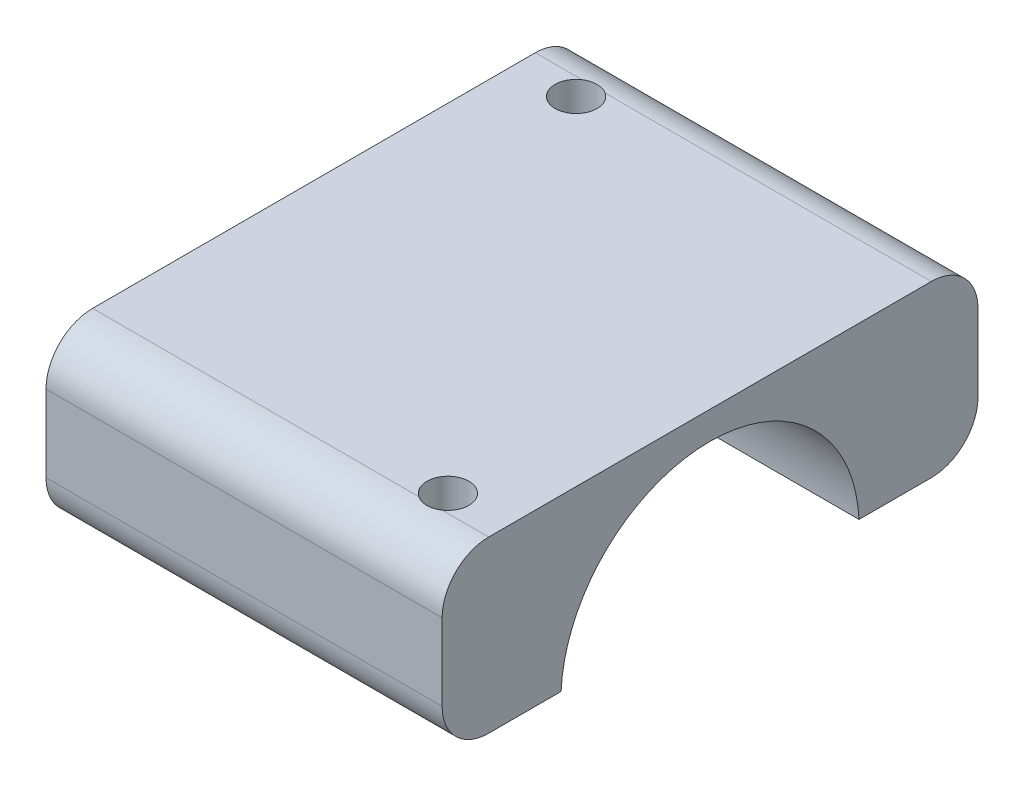
ISO-10303-21;
HEADER;
FILE_DESCRIPTION(('STEP AP214'),'2;1');
FILE_NAME('part.step','',(''),(''),'','','');
FILE_SCHEMA(('AUTOMOTIVE_DESIGN { 1 0 10303 214 1 1 1 1 }'));
ENDSEC;
DATA;
#1=APPLICATION_CONTEXT('core data for automotive mechanical design processes');
#2=APPLICATION_PROTOCOL_DEFINITION('international standard','automotive_design',2000,#1);
#3=PRODUCT_CONTEXT('',#1,'mechanical');
#4=PRODUCT('Part','Part','',(#3));
#5=PRODUCT_RELATED_PRODUCT_CATEGORY('part','',(#4));
#6=PRODUCT_DEFINITION_FORMATION('','',#4);
#7=PRODUCT_DEFINITION_CONTEXT('part definition',#1,'design');
#8=PRODUCT_DEFINITION('design','',#6,#7);
#9=PRODUCT_DEFINITION_SHAPE('','',#8);
#10=(LENGTH_UNIT() NAMED_UNIT(*) SI_UNIT(.MILLI.,.METRE.));
#11=(NAMED_UNIT(*) PLANE_ANGLE_UNIT() SI_UNIT($,.RADIAN.));
#12=(NAMED_UNIT(*) SI_UNIT($,.STERADIAN.) SOLID_ANGLE_UNIT());
#13=UNCERTAINTY_MEASURE_WITH_UNIT(LENGTH_MEASURE(1.E-05),#10,'distance_accuracy_value','');
#14=(GEOMETRIC_REPRESENTATION_CONTEXT(3) GLOBAL_UNCERTAINTY_ASSIGNED_CONTEXT((#13)) GLOBAL_UNIT_ASSIGNED_CONTEXT((#10,
#11,#12)) REPRESENTATION_CONTEXT('',''));
#15=CARTESIAN_POINT('',(0.,0.,0.));
#16=DIRECTION('',(0.,0.,1.));
#17=DIRECTION('',(1.,0.,0.));
#18=AXIS2_PLACEMENT_3D('',#15,#16,#17);
#19=CARTESIAN_POINT('',(17.,4.6,19.));
#20=DIRECTION('',(-1.,0.,0.));
#21=DIRECTION('',(0.,0.,1.));
#22=AXIS2_PLACEMENT_3D('',#19,#20,#21);
#23=CYLINDRICAL_SURFACE('',#22,4.);
#24=CARTESIAN_POINT('',(12.9949874371066,0.6,19.));
#25=CARTESIAN_POINT('',(12.9528080505859,0.600002290201008,19.0279782687762));
#26=CARTESIAN_POINT('',(12.9094699375662,0.600293109258532,19.054162436945));
#27=CARTESIAN_POINT('',(12.8207506643026,0.601246630542694,19.1027880961604));
#28=CARTESIAN_POINT('',(12.775369663094,0.601909303866988,19.1252298779078));
#29=CARTESIAN_POINT('',(12.6367080465194,0.60414515604213,19.1866521635867));
#30=CARTESIAN_POINT('',(12.5407755741953,0.605967454515857,19.2198177956695));
#31=CARTESIAN_POINT('',(12.3447108790185,0.609016111648687,19.2695824039112));
#32=CARTESIAN_POINT('',(12.2445771529861,0.610242254997947,19.2861753969049));
#33=CARTESIAN_POINT('',(12.0429252939834,0.611432977587128,19.3023260095373));
#34=CARTESIAN_POINT('',(11.9414072407699,0.611397629202322,19.3018846064864));
#35=CARTESIAN_POINT('',(11.7400149572337,0.6100843959537,19.2839916011113));
#36=CARTESIAN_POINT('',(11.6401391343925,0.608807797075412,19.266557603754));
#37=CARTESIAN_POINT('',(11.444762981889,0.605710678825216,19.2151942389305));
#38=CARTESIAN_POINT('',(11.3492591599958,0.603890602630139,19.181278297527));
#39=CARTESIAN_POINT('',(11.2134628948282,0.601745422922836,19.1197807652606));
#40=CARTESIAN_POINT('',(11.1703945654969,0.601136078493984,19.0981480345368));
#41=CARTESIAN_POINT('',(11.0862091669758,0.600264553601652,19.0515455180329));
#42=CARTESIAN_POINT('',(11.0450884560688,0.600001698383489,19.0265823227808));
#43=CARTESIAN_POINT('',(11.0050125628934,0.6,19.));
#44=B_SPLINE_CURVE_WITH_KNOTS('',3,(#24,#25,#26,#27,#28,#29,#30,#31,#32,#33,#34,#35,#36,#37,#38,
#39,#40,#41,#42,#43),.UNSPECIFIED.,.F.,.F.,(4,2,2,2,2,2,2,2,2,4),(0.,0.151748564164442,
0.30348533531734,0.606485618853393,0.90959525408197,1.21268749909945,1.51546606256915,
1.81799839737315,1.96246492195647,2.10664969408635),.UNSPECIFIED.);
#45=CARTESIAN_POINT('',(12.9949874371066,0.6,19.));
#46=VERTEX_POINT('',#45);
#47=CARTESIAN_POINT('',(11.0050125628934,0.6,19.));
#48=VERTEX_POINT('',#47);
#49=EDGE_CURVE('E136',#46,#48,#44,.T.);
#50=ORIENTED_EDGE('',*,*,#49,.F.);
#51=DIRECTION('',(-1.,0.,0.));
#52=VECTOR('',#51,1.);
#53=CARTESIAN_POINT('',(17.,0.6,19.));
#54=LINE('',#53,#52);
#55=CARTESIAN_POINT('',(17.,0.6,19.));
#56=VERTEX_POINT('',#55);
#57=EDGE_CURVE('E150',#56,#46,#54,.T.);
#58=ORIENTED_EDGE('',*,*,#57,.F.);
#59=CARTESIAN_POINT('',(17.,4.6,19.));
#60=DIRECTION('',(1.,0.,0.));
#61=DIRECTION('',(0.,0.,-1.));
#62=AXIS2_PLACEMENT_3D('',#59,#60,#61);
#63=CIRCLE('',#62,4.);
#64=CARTESIAN_POINT('',(17.,4.6,23.));
#65=VERTEX_POINT('',#64);
#66=EDGE_CURVE('E333',#65,#56,#63,.T.);
#67=ORIENTED_EDGE('',*,*,#66,.F.);
#68=DIRECTION('',(-1.,0.,0.));
#69=VECTOR('',#68,1.);
#70=CARTESIAN_POINT('',(17.,4.6,23.));
#71=LINE('',#70,#69);
#72=CARTESIAN_POINT('',(-17.,4.6,23.));
#73=VERTEX_POINT('',#72);
#74=EDGE_CURVE('E313',#65,#73,#71,.T.);
#75=ORIENTED_EDGE('',*,*,#74,.T.);
#76=CARTESIAN_POINT('',(-17.,4.6,19.));
#77=DIRECTION('',(1.,0.,0.));
#78=DIRECTION('',(0.,0.,-1.));
#79=AXIS2_PLACEMENT_3D('',#76,#77,#78);
#80=CIRCLE('',#79,4.);
#81=CARTESIAN_POINT('',(-17.,0.6,19.));
#82=VERTEX_POINT('',#81);
#83=EDGE_CURVE('E155',#73,#82,#80,.T.);
#84=ORIENTED_EDGE('',*,*,#83,.T.);
#85=EDGE_CURVE('E148',#48,#82,#54,.T.);
#86=ORIENTED_EDGE('',*,*,#85,.F.);
#87=EDGE_LOOP('',(#50,#58,#67,#75,#84,#86));
#88=FACE_BOUND('',#87,.T.);
#89=ADVANCED_FACE('F39',(#88),#23,.T.);
#90=CARTESIAN_POINT('',(17.,4.6,-19.));
#91=DIRECTION('',(-1.,0.,0.));
#92=DIRECTION('',(0.,0.,1.));
#93=AXIS2_PLACEMENT_3D('',#90,#91,#92);
#94=CYLINDRICAL_SURFACE('',#93,4.);
#95=CARTESIAN_POINT('',(-12.9949874371066,0.6,-19.));
#96=CARTESIAN_POINT('',(-12.9528080505859,0.600002290201007,-19.0279782687762));
#97=CARTESIAN_POINT('',(-12.9094699375662,0.600293109258532,-19.054162436945));
#98=CARTESIAN_POINT('',(-12.8207506643026,0.601246630542693,-19.1027880961604));
#99=CARTESIAN_POINT('',(-12.7753696630941,0.601909303866988,-19.1252298779078));
#100=CARTESIAN_POINT('',(-12.6367080465194,0.60414515604213,-19.1866521635867));
#101=CARTESIAN_POINT('',(-12.5407755741953,0.605967454515857,-19.2198177956695));
#102=CARTESIAN_POINT('',(-12.3447108790185,0.609016111648687,-19.2695824039112));
#103=CARTESIAN_POINT('',(-12.2445771529861,0.610242254997947,-19.2861753969049));
#104=CARTESIAN_POINT('',(-12.0429252939834,0.611432977587128,-19.3023260095373));
#105=CARTESIAN_POINT('',(-11.9414072407699,0.611397629202323,-19.3018846064864));
#106=CARTESIAN_POINT('',(-11.7400149572337,0.6100843959537,-19.2839916011113));
#107=CARTESIAN_POINT('',(-11.6401391343925,0.608807797075411,-19.266557603754));
#108=CARTESIAN_POINT('',(-11.444762981889,0.605710678825215,-19.2151942389305));
#109=CARTESIAN_POINT('',(-11.3492591599958,0.603890602630139,-19.181278297527));
#110=CARTESIAN_POINT('',(-11.2134628948282,0.601745422922837,-19.1197807652606));
#111=CARTESIAN_POINT('',(-11.1703945654969,0.601136078493984,-19.0981480345368));
#112=CARTESIAN_POINT('',(-11.0862091669758,0.600264553601652,-19.0515455180329));
#113=CARTESIAN_POINT('',(-11.0450884560688,0.600001698383489,-19.0265823227808));
#114=CARTESIAN_POINT('',(-11.0050125628934,0.6,-19.));
#115=B_SPLINE_CURVE_WITH_KNOTS('',3,(#95,#96,#97,#98,#99,#100,#101,#102,#103,#104,#105,#106,
#107,#108,#109,#110,#111,#112,#113,#114),.UNSPECIFIED.,.F.,.F.,(4,2,2,2,2,2,2,2,2,4),(0.,
0.15174856416444,0.303485335317343,0.606485618853397,0.909595254081976,1.21268749909945,
1.51546606256916,1.81799839737315,1.96246492195647,2.10664969408635),.UNSPECIFIED.);
#116=CARTESIAN_POINT('',(-12.9949874371066,0.6,-19.));
#117=VERTEX_POINT('',#116);
#118=CARTESIAN_POINT('',(-11.0050125628934,0.6,-19.));
#119=VERTEX_POINT('',#118);
#120=EDGE_CURVE('E194',#117,#119,#115,.T.);
#121=ORIENTED_EDGE('',*,*,#120,.F.);
#122=DIRECTION('',(-1.,0.,0.));
#123=VECTOR('',#122,1.);
#124=CARTESIAN_POINT('',(17.,0.6,-19.));
#125=LINE('',#124,#123);
#126=CARTESIAN_POINT('',(-17.,0.6,-19.));
#127=VERTEX_POINT('',#126);
#128=EDGE_CURVE('E159',#117,#127,#125,.T.);
#129=ORIENTED_EDGE('',*,*,#128,.T.);
#130=CARTESIAN_POINT('',(-17.,4.6,-19.));
#131=DIRECTION('',(1.,0.,0.));
#132=DIRECTION('',(0.,0.,-1.));
#133=AXIS2_PLACEMENT_3D('',#130,#131,#132);
#134=CIRCLE('',#133,4.);
#135=CARTESIAN_POINT('',(-17.,4.6,-23.));
#136=VERTEX_POINT('',#135);
#137=EDGE_CURVE('E319',#127,#136,#134,.T.);
#138=ORIENTED_EDGE('',*,*,#137,.T.);
#139=DIRECTION('',(-1.,0.,0.));
#140=VECTOR('',#139,1.);
#141=CARTESIAN_POINT('',(17.,4.6,-23.));
#142=LINE('',#141,#140);
#143=CARTESIAN_POINT('',(17.,4.6,-23.));
#144=VERTEX_POINT('',#143);
#145=EDGE_CURVE('E293',#144,#136,#142,.T.);
#146=ORIENTED_EDGE('',*,*,#145,.F.);
#147=CARTESIAN_POINT('',(17.,4.6,-19.));
#148=DIRECTION('',(1.,0.,0.));
#149=DIRECTION('',(0.,0.,-1.));
#150=AXIS2_PLACEMENT_3D('',#147,#148,#149);
#151=CIRCLE('',#150,4.);
#152=CARTESIAN_POINT('',(17.,0.6,-19.));
#153=VERTEX_POINT('',#152);
#154=EDGE_CURVE('E291',#153,#144,#151,.T.);
#155=ORIENTED_EDGE('',*,*,#154,.F.);
#156=EDGE_CURVE('E156',#153,#119,#125,.T.);
#157=ORIENTED_EDGE('',*,*,#156,.T.);
#158=EDGE_LOOP('',(#121,#129,#138,#146,#155,#157));
#159=FACE_BOUND('',#158,.T.);
#160=ADVANCED_FACE('F205',(#159),#94,.T.);
#161=CARTESIAN_POINT('',(17.,11.188,-19.));
#162=DIRECTION('',(-1.,0.,0.));
#163=DIRECTION('',(0.,0.,1.));
#164=AXIS2_PLACEMENT_3D('',#161,#162,#163);
#165=CYLINDRICAL_SURFACE('',#164,4.);
#166=CARTESIAN_POINT('',(-11.0050125628934,15.188,-19.));
#167=CARTESIAN_POINT('',(-11.0471919494141,15.187997709799,-19.0279782687762));
#168=CARTESIAN_POINT('',(-11.0905300624338,15.1877068907415,-19.054162436945));
#169=CARTESIAN_POINT('',(-11.1792493356974,15.1867533694573,-19.1027880961604));
#170=CARTESIAN_POINT('',(-11.224630336906,15.186090696133,-19.1252298779078));
#171=CARTESIAN_POINT('',(-11.3632919534806,15.1838548439579,-19.1866521635867));
#172=CARTESIAN_POINT('',(-11.4592244258047,15.1820325454841,-19.2198177956695));
#173=CARTESIAN_POINT('',(-11.6552891209815,15.1789838883513,-19.2695824039112));
#174=CARTESIAN_POINT('',(-11.7554228470139,15.1777577450021,-19.2861753969049));
#175=CARTESIAN_POINT('',(-11.9570747060166,15.1765670224129,-19.3023260095373));
#176=CARTESIAN_POINT('',(-12.0585927592301,15.1766023707977,-19.3018846064864));
#177=CARTESIAN_POINT('',(-12.2599850427663,15.1779156040463,-19.2839916011113));
#178=CARTESIAN_POINT('',(-12.3598608656075,15.1791922029246,-19.266557603754));
#179=CARTESIAN_POINT('',(-12.555237018111,15.1822893211748,-19.2151942389305));
#180=CARTESIAN_POINT('',(-12.6507408400042,15.1841093973699,-19.181278297527));
#181=CARTESIAN_POINT('',(-12.7865371051718,15.1862545770772,-19.1197807652606));
#182=CARTESIAN_POINT('',(-12.8296054345031,15.186863921506,-19.0981480345368));
#183=CARTESIAN_POINT('',(-12.9137908330242,15.1877354463983,-19.0515455180329));
#184=CARTESIAN_POINT('',(-12.9549115439312,15.1879983016165,-19.0265823227808));
#185=CARTESIAN_POINT('',(-12.9949874371066,15.188,-19.));
#186=B_SPLINE_CURVE_WITH_KNOTS('',3,(#166,#167,#168,#169,#170,#171,#172,#173,#174,#175,#176,
#177,#178,#179,#180,#181,#182,#183,#184,#185),.UNSPECIFIED.,.F.,.F.,(4,2,2,2,2,2,2,2,2,4),(0.,
0.15174856416444,0.303485335317342,0.60648561885339,0.909595254081968,1.21268749909944,
1.51546606256915,1.81799839737315,1.96246492195647,2.10664969408635),.UNSPECIFIED.);
#187=CARTESIAN_POINT('',(-11.0050125628934,15.188,-19.));
#188=VERTEX_POINT('',#187);
#189=CARTESIAN_POINT('',(-12.9949874371066,15.188,-19.));
#190=VERTEX_POINT('',#189);
#191=EDGE_CURVE('E142',#188,#190,#186,.T.);
#192=ORIENTED_EDGE('',*,*,#191,.F.);
#193=DIRECTION('',(-1.,0.,0.));
#194=VECTOR('',#193,1.);
#195=CARTESIAN_POINT('',(17.,15.188,-19.));
#196=LINE('',#195,#194);
#197=CARTESIAN_POINT('',(17.,15.188,-19.));
#198=VERTEX_POINT('',#197);
#199=EDGE_CURVE('E343',#198,#188,#196,.T.);
#200=ORIENTED_EDGE('',*,*,#199,.F.);
#201=CARTESIAN_POINT('',(17.,11.188,-19.));
#202=DIRECTION('',(1.,0.,0.));
#203=DIRECTION('',(0.,0.,-1.));
#204=AXIS2_PLACEMENT_3D('',#201,#202,#203);
#205=CIRCLE('',#204,4.);
#206=CARTESIAN_POINT('',(17.,11.188,-23.));
#207=VERTEX_POINT('',#206);
#208=EDGE_CURVE('E299',#207,#198,#205,.T.);
#209=ORIENTED_EDGE('',*,*,#208,.F.);
#210=DIRECTION('',(-1.,0.,0.));
#211=VECTOR('',#210,1.);
#212=CARTESIAN_POINT('',(17.,11.188,-23.));
#213=LINE('',#212,#211);
#214=CARTESIAN_POINT('',(-17.,11.188,-23.));
#215=VERTEX_POINT('',#214);
#216=EDGE_CURVE('E346',#207,#215,#213,.T.);
#217=ORIENTED_EDGE('',*,*,#216,.T.);
#218=CARTESIAN_POINT('',(-17.,11.188,-19.));
#219=DIRECTION('',(1.,0.,0.));
#220=DIRECTION('',(0.,0.,-1.));
#221=AXIS2_PLACEMENT_3D('',#218,#219,#220);
#222=CIRCLE('',#221,4.);
#223=CARTESIAN_POINT('',(-17.,15.188,-19.));
#224=VERTEX_POINT('',#223);
#225=EDGE_CURVE('E323',#215,#224,#222,.T.);
#226=ORIENTED_EDGE('',*,*,#225,.T.);
#227=EDGE_CURVE('E342',#190,#224,#196,.T.);
#228=ORIENTED_EDGE('',*,*,#227,.F.);
#229=EDGE_LOOP('',(#192,#200,#209,#217,#226,#228));
#230=FACE_BOUND('',#229,.T.);
#231=ADVANCED_FACE('F201',(#230),#165,.T.);
#232=CARTESIAN_POINT('',(17.,11.188,19.));
#233=DIRECTION('',(-1.,0.,0.));
#234=DIRECTION('',(0.,0.,1.));
#235=AXIS2_PLACEMENT_3D('',#232,#233,#234);
#236=CYLINDRICAL_SURFACE('',#235,4.);
#237=CARTESIAN_POINT('',(11.0050125628934,15.188,19.));
#238=CARTESIAN_POINT('',(11.0471919494141,15.187997709799,19.0279782687762));
#239=CARTESIAN_POINT('',(11.0905300624338,15.1877068907415,19.054162436945));
#240=CARTESIAN_POINT('',(11.1792493356974,15.1867533694573,19.1027880961604));
#241=CARTESIAN_POINT('',(11.224630336906,15.186090696133,19.1252298779078));
#242=CARTESIAN_POINT('',(11.3632919534806,15.1838548439579,19.1866521635867));
#243=CARTESIAN_POINT('',(11.4592244258047,15.1820325454841,19.2198177956695));
#244=CARTESIAN_POINT('',(11.6552891209815,15.1789838883513,19.2695824039112));
#245=CARTESIAN_POINT('',(11.7554228470139,15.1777577450021,19.2861753969049));
#246=CARTESIAN_POINT('',(11.9570747060166,15.1765670224129,19.3023260095373));
#247=CARTESIAN_POINT('',(12.0585927592301,15.1766023707977,19.3018846064864));
#248=CARTESIAN_POINT('',(12.2599850427663,15.1779156040463,19.2839916011113));
#249=CARTESIAN_POINT('',(12.3598608656075,15.1791922029246,19.266557603754));
#250=CARTESIAN_POINT('',(12.555237018111,15.1822893211748,19.2151942389305));
#251=CARTESIAN_POINT('',(12.6507408400042,15.1841093973699,19.181278297527));
#252=CARTESIAN_POINT('',(12.7865371051718,15.1862545770772,19.1197807652606));
#253=CARTESIAN_POINT('',(12.8296054345031,15.186863921506,19.0981480345368));
#254=CARTESIAN_POINT('',(12.9137908330242,15.1877354463983,19.0515455180329));
#255=CARTESIAN_POINT('',(12.9549115439312,15.1879983016165,19.0265823227808));
#256=CARTESIAN_POINT('',(12.9949874371066,15.188,19.));
#257=B_SPLINE_CURVE_WITH_KNOTS('',3,(#237,#238,#239,#240,#241,#242,#243,#244,#245,#246,#247,
#248,#249,#250,#251,#252,#253,#254,#255,#256),.UNSPECIFIED.,.F.,.F.,(4,2,2,2,2,2,2,2,2,4),(0.,
0.151748564164442,0.30348533531734,0.606485618853393,0.909595254081972,1.21268749909945,
1.51546606256915,1.81799839737315,1.96246492195647,2.10664969408635),.UNSPECIFIED.);
#258=CARTESIAN_POINT('',(11.0050125628934,15.188,19.));
#259=VERTEX_POINT('',#258);
#260=CARTESIAN_POINT('',(12.9949874371066,15.188,19.));
#261=VERTEX_POINT('',#260);
#262=EDGE_CURVE('E47',#259,#261,#257,.T.);
#263=ORIENTED_EDGE('',*,*,#262,.F.);
#264=DIRECTION('',(-1.,0.,0.));
#265=VECTOR('',#264,1.);
#266=CARTESIAN_POINT('',(17.,15.188,19.));
#267=LINE('',#266,#265);
#268=CARTESIAN_POINT('',(-17.,15.188,19.));
#269=VERTEX_POINT('',#268);
#270=EDGE_CURVE('E338',#259,#269,#267,.T.);
#271=ORIENTED_EDGE('',*,*,#270,.T.);
#272=CARTESIAN_POINT('',(-17.,11.188,19.));
#273=DIRECTION('',(1.,0.,0.));
#274=DIRECTION('',(0.,0.,-1.));
#275=AXIS2_PLACEMENT_3D('',#272,#273,#274);
#276=CIRCLE('',#275,4.);
#277=CARTESIAN_POINT('',(-17.,11.188,23.));
#278=VERTEX_POINT('',#277);
#279=EDGE_CURVE('E329',#269,#278,#276,.T.);
#280=ORIENTED_EDGE('',*,*,#279,.T.);
#281=DIRECTION('',(-1.,0.,0.));
#282=VECTOR('',#281,1.);
#283=CARTESIAN_POINT('',(17.,11.188,23.));
#284=LINE('',#283,#282);
#285=CARTESIAN_POINT('',(17.,11.188,23.));
#286=VERTEX_POINT('',#285);
#287=EDGE_CURVE('E335',#286,#278,#284,.T.);
#288=ORIENTED_EDGE('',*,*,#287,.F.);
#289=CARTESIAN_POINT('',(17.,11.188,19.));
#290=DIRECTION('',(1.,0.,0.));
#291=DIRECTION('',(0.,0.,-1.));
#292=AXIS2_PLACEMENT_3D('',#289,#290,#291);
#293=CIRCLE('',#292,4.);
#294=CARTESIAN_POINT('',(17.,15.188,19.));
#295=VERTEX_POINT('',#294);
#296=EDGE_CURVE('E309',#295,#286,#293,.T.);
#297=ORIENTED_EDGE('',*,*,#296,.F.);
#298=EDGE_CURVE('E339',#295,#261,#267,.T.);
#299=ORIENTED_EDGE('',*,*,#298,.T.);
#300=EDGE_LOOP('',(#263,#271,#280,#288,#297,#299));
#301=FACE_BOUND('',#300,.T.);
#302=ADVANCED_FACE('F168',(#301),#236,.T.);
#303=CARTESIAN_POINT('',(17.,0.6,19.));
#304=DIRECTION('',(0.,1.,0.));
#305=DIRECTION('',(0.,0.,1.));
#306=AXIS2_PLACEMENT_3D('',#303,#304,#305);
#307=PLANE('',#306);
#308=CARTESIAN_POINT('',(12.,0.6,17.5));
#309=DIRECTION('',(0.,1.,0.));
#310=DIRECTION('',(0.,0.,1.));
#311=AXIS2_PLACEMENT_3D('',#308,#309,#310);
#312=CIRCLE('',#311,1.8);
#313=EDGE_CURVE('E53',#46,#48,#312,.T.);
#314=ORIENTED_EDGE('',*,*,#313,.T.);
#315=ORIENTED_EDGE('',*,*,#85,.T.);
#316=DIRECTION('',(0.,0.,-1.));
#317=VECTOR('',#316,1.);
#318=CARTESIAN_POINT('',(-17.,0.6,19.));
#319=LINE('',#318,#317);
#320=CARTESIAN_POINT('',(-17.,0.6,12.7859297667397));
#321=VERTEX_POINT('',#320);
#322=EDGE_CURVE('E317',#82,#321,#319,.T.);
#323=ORIENTED_EDGE('',*,*,#322,.T.);
#324=DIRECTION('',(1.,0.,0.));
#325=VECTOR('',#324,1.);
#326=CARTESIAN_POINT('',(-17.,0.6,12.7859297667397));
#327=LINE('',#326,#325);
#328=CARTESIAN_POINT('',(17.,0.6,12.7859297667397));
#329=VERTEX_POINT('',#328);
#330=EDGE_CURVE('E316',#321,#329,#327,.T.);
#331=ORIENTED_EDGE('',*,*,#330,.T.);
#332=DIRECTION('',(0.,0.,-1.));
#333=VECTOR('',#332,1.);
#334=CARTESIAN_POINT('',(17.,0.6,19.));
#335=LINE('',#334,#333);
#336=EDGE_CURVE('E297',#56,#329,#335,.T.);
#337=ORIENTED_EDGE('',*,*,#336,.F.);
#338=ORIENTED_EDGE('',*,*,#57,.T.);
#339=EDGE_LOOP('',(#314,#315,#323,#331,#337,#338));
#340=FACE_BOUND('',#339,.T.);
#341=ADVANCED_FACE('F146',(#340),#307,.F.);
#342=CARTESIAN_POINT('',(-12.,0.6,-17.5));
#343=DIRECTION('',(0.,1.,0.));
#344=DIRECTION('',(0.,0.,1.));
#345=AXIS2_PLACEMENT_3D('',#342,#343,#344);
#346=CIRCLE('',#345,1.8);
#347=EDGE_CURVE('E60',#117,#119,#346,.T.);
#348=ORIENTED_EDGE('',*,*,#347,.T.);
#349=ORIENTED_EDGE('',*,*,#156,.F.);
#350=CARTESIAN_POINT('',(17.,0.6,-12.7859297667397));
#351=VERTEX_POINT('',#350);
#352=EDGE_CURVE('E302',#351,#153,#335,.T.);
#353=ORIENTED_EDGE('',*,*,#352,.F.);
#354=DIRECTION('',(1.,0.,0.));
#355=VECTOR('',#354,1.);
#356=CARTESIAN_POINT('',(-17.,0.6,-12.7859297667397));
#357=LINE('',#356,#355);
#358=CARTESIAN_POINT('',(-17.,0.6,-12.7859297667397));
#359=VERTEX_POINT('',#358);
#360=EDGE_CURVE('E352',#351,#359,#357,.F.);
#361=ORIENTED_EDGE('',*,*,#360,.T.);
#362=EDGE_CURVE('E315',#359,#127,#319,.T.);
#363=ORIENTED_EDGE('',*,*,#362,.T.);
#364=ORIENTED_EDGE('',*,*,#128,.F.);
#365=EDGE_LOOP('',(#348,#349,#353,#361,#363,#364));
#366=FACE_BOUND('',#365,.T.);
#367=ADVANCED_FACE('F210',(#366),#307,.F.);
#368=CARTESIAN_POINT('',(17.,4.6,-23.));
#369=DIRECTION('',(0.,0.,1.));
#370=DIRECTION('',(1.,0.,0.));
#371=AXIS2_PLACEMENT_3D('',#368,#369,#370);
#372=PLANE('',#371);
#373=DIRECTION('',(0.,1.,0.));
#374=VECTOR('',#373,1.);
#375=CARTESIAN_POINT('',(-17.,4.6,-23.));
#376=LINE('',#375,#374);
#377=EDGE_CURVE('E321',#136,#215,#376,.T.);
#378=ORIENTED_EDGE('',*,*,#377,.T.);
#379=ORIENTED_EDGE('',*,*,#216,.F.);
#380=DIRECTION('',(0.,1.,0.));
#381=VECTOR('',#380,1.);
#382=CARTESIAN_POINT('',(17.,4.6,-23.));
#383=LINE('',#382,#381);
#384=EDGE_CURVE('E296',#144,#207,#383,.T.);
#385=ORIENTED_EDGE('',*,*,#384,.F.);
#386=ORIENTED_EDGE('',*,*,#145,.T.);
#387=EDGE_LOOP('',(#378,#379,#385,#386));
#388=FACE_BOUND('',#387,.T.);
#389=ADVANCED_FACE('F208',(#388),#372,.F.);
#390=CARTESIAN_POINT('',(17.,15.188,-19.));
#391=DIRECTION('',(0.,-1.,0.));
#392=DIRECTION('',(0.,0.,-1.));
#393=AXIS2_PLACEMENT_3D('',#390,#391,#392);
#394=PLANE('',#393);
#395=CARTESIAN_POINT('',(12.,15.188,17.5));
#396=DIRECTION('',(0.,-1.,0.));
#397=DIRECTION('',(0.,0.,-1.));
#398=AXIS2_PLACEMENT_3D('',#395,#396,#397);
#399=CIRCLE('',#398,1.8);
#400=EDGE_CURVE('E143',#261,#259,#399,.F.);
#401=ORIENTED_EDGE('',*,*,#400,.F.);
#402=ORIENTED_EDGE('',*,*,#298,.F.);
#403=DIRECTION('',(0.,0.,1.));
#404=VECTOR('',#403,1.);
#405=CARTESIAN_POINT('',(17.,15.188,-19.));
#406=LINE('',#405,#404);
#407=EDGE_CURVE('E307',#198,#295,#406,.T.);
#408=ORIENTED_EDGE('',*,*,#407,.F.);
#409=ORIENTED_EDGE('',*,*,#199,.T.);
#410=CARTESIAN_POINT('',(-12.,15.188,-17.5));
#411=DIRECTION('',(0.,-1.,0.));
#412=DIRECTION('',(0.,0.,-1.));
#413=AXIS2_PLACEMENT_3D('',#410,#411,#412);
#414=CIRCLE('',#413,1.8);
#415=EDGE_CURVE('E11',#190,#188,#414,.F.);
#416=ORIENTED_EDGE('',*,*,#415,.F.);
#417=ORIENTED_EDGE('',*,*,#227,.T.);
#418=DIRECTION('',(0.,0.,1.));
#419=VECTOR('',#418,1.);
#420=CARTESIAN_POINT('',(-17.,15.188,-19.));
#421=LINE('',#420,#419);
#422=EDGE_CURVE('E326',#224,#269,#421,.T.);
#423=ORIENTED_EDGE('',*,*,#422,.T.);
#424=ORIENTED_EDGE('',*,*,#270,.F.);
#425=EDGE_LOOP('',(#401,#402,#408,#409,#416,#417,#423,#424));
#426=FACE_BOUND('',#425,.T.);
#427=ADVANCED_FACE('F207',(#426),#394,.F.);
#428=CARTESIAN_POINT('',(17.,11.188,23.));
#429=DIRECTION('',(0.,0.,-1.));
#430=DIRECTION('',(-1.,0.,0.));
#431=AXIS2_PLACEMENT_3D('',#428,#429,#430);
#432=PLANE('',#431);
#433=DIRECTION('',(0.,-1.,0.));
#434=VECTOR('',#433,1.);
#435=CARTESIAN_POINT('',(-17.,11.188,23.));
#436=LINE('',#435,#434);
#437=EDGE_CURVE('E331',#278,#73,#436,.T.);
#438=ORIENTED_EDGE('',*,*,#437,.T.);
#439=ORIENTED_EDGE('',*,*,#74,.F.);
#440=DIRECTION('',(0.,-1.,0.));
#441=VECTOR('',#440,1.);
#442=CARTESIAN_POINT('',(17.,11.188,23.));
#443=LINE('',#442,#441);
#444=EDGE_CURVE('E311',#286,#65,#443,.T.);
#445=ORIENTED_EDGE('',*,*,#444,.F.);
#446=ORIENTED_EDGE('',*,*,#287,.T.);
#447=EDGE_LOOP('',(#438,#439,#445,#446));
#448=FACE_BOUND('',#447,.T.);
#449=ADVANCED_FACE('F376',(#448),#432,.F.);
#450=CARTESIAN_POINT('',(17.,4.6,19.));
#451=DIRECTION('',(1.,0.,0.));
#452=DIRECTION('',(0.,0.,-1.));
#453=AXIS2_PLACEMENT_3D('',#450,#451,#452);
#454=PLANE('',#453);
#455=CARTESIAN_POINT('',(17.,0.,0.));
#456=DIRECTION('',(1.,0.,0.));
#457=DIRECTION('',(0.,0.,-1.));
#458=AXIS2_PLACEMENT_3D('',#455,#456,#457);
#459=CIRCLE('',#458,12.8);
#460=EDGE_CURVE('E285',#351,#329,#459,.T.);
#461=ORIENTED_EDGE('',*,*,#460,.F.);
#462=ORIENTED_EDGE('',*,*,#352,.T.);
#463=ORIENTED_EDGE('',*,*,#154,.T.);
#464=ORIENTED_EDGE('',*,*,#384,.T.);
#465=ORIENTED_EDGE('',*,*,#208,.T.);
#466=ORIENTED_EDGE('',*,*,#407,.T.);
#467=ORIENTED_EDGE('',*,*,#296,.T.);
#468=ORIENTED_EDGE('',*,*,#444,.T.);
#469=ORIENTED_EDGE('',*,*,#66,.T.);
#470=ORIENTED_EDGE('',*,*,#336,.T.);
#471=EDGE_LOOP('',(#461,#462,#463,#464,#465,#466,#467,#468,#469,#470));
#472=FACE_BOUND('',#471,.T.);
#473=ADVANCED_FACE('F363',(#472),#454,.T.);
#474=CARTESIAN_POINT('',(-17.,4.6,19.));
#475=DIRECTION('',(1.,0.,0.));
#476=DIRECTION('',(0.,0.,-1.));
#477=AXIS2_PLACEMENT_3D('',#474,#475,#476);
#478=PLANE('',#477);
#479=ORIENTED_EDGE('',*,*,#362,.F.);
#480=CARTESIAN_POINT('',(-17.,0.,0.));
#481=DIRECTION('',(1.,0.,0.));
#482=DIRECTION('',(0.,0.,-1.));
#483=AXIS2_PLACEMENT_3D('',#480,#481,#482);
#484=CIRCLE('',#483,12.8);
#485=EDGE_CURVE('E383',#359,#321,#484,.T.);
#486=ORIENTED_EDGE('',*,*,#485,.T.);
#487=ORIENTED_EDGE('',*,*,#322,.F.);
#488=ORIENTED_EDGE('',*,*,#83,.F.);
#489=ORIENTED_EDGE('',*,*,#437,.F.);
#490=ORIENTED_EDGE('',*,*,#279,.F.);
#491=ORIENTED_EDGE('',*,*,#422,.F.);
#492=ORIENTED_EDGE('',*,*,#225,.F.);
#493=ORIENTED_EDGE('',*,*,#377,.F.);
#494=ORIENTED_EDGE('',*,*,#137,.F.);
#495=EDGE_LOOP('',(#479,#486,#487,#488,#489,#490,#491,#492,#493,#494));
#496=FACE_BOUND('',#495,.T.);
#497=ADVANCED_FACE('F254',(#496),#478,.F.);
#498=CARTESIAN_POINT('',(-17.,0.,0.));
#499=DIRECTION('',(1.,0.,0.));
#500=DIRECTION('',(0.,0.,-1.));
#501=AXIS2_PLACEMENT_3D('',#498,#499,#500);
#502=CYLINDRICAL_SURFACE('',#501,12.8);
#503=ORIENTED_EDGE('',*,*,#485,.F.);
#504=ORIENTED_EDGE('',*,*,#360,.F.);
#505=ORIENTED_EDGE('',*,*,#460,.T.);
#506=ORIENTED_EDGE('',*,*,#330,.F.);
#507=EDGE_LOOP('',(#503,#504,#505,#506));
#508=FACE_BOUND('',#507,.T.);
#509=ADVANCED_FACE('F176',(#508),#502,.F.);
#510=CARTESIAN_POINT('',(12.,15.788,17.5));
#511=DIRECTION('',(0.,-1.,0.));
#512=DIRECTION('',(0.,0.,-1.));
#513=AXIS2_PLACEMENT_3D('',#510,#511,#512);
#514=CYLINDRICAL_SURFACE('',#513,1.8);
#515=ORIENTED_EDGE('',*,*,#400,.T.);
#516=ORIENTED_EDGE('',*,*,#262,.T.);
#517=EDGE_LOOP('',(#515,#516));
#518=FACE_BOUND('',#517,.T.);
#519=ORIENTED_EDGE('',*,*,#49,.T.);
#520=ORIENTED_EDGE('',*,*,#313,.F.);
#521=EDGE_LOOP('',(#519,#520));
#522=FACE_BOUND('',#521,.T.);
#523=ADVANCED_FACE('F137',(#518,#522),#514,.F.);
#524=CARTESIAN_POINT('',(-12.,15.788,-17.5));
#525=DIRECTION('',(0.,-1.,0.));
#526=DIRECTION('',(0.,0.,-1.));
#527=AXIS2_PLACEMENT_3D('',#524,#525,#526);
#528=CYLINDRICAL_SURFACE('',#527,1.8);
#529=ORIENTED_EDGE('',*,*,#191,.T.);
#530=ORIENTED_EDGE('',*,*,#415,.T.);
#531=EDGE_LOOP('',(#529,#530));
#532=FACE_BOUND('',#531,.T.);
#533=ORIENTED_EDGE('',*,*,#120,.T.);
#534=ORIENTED_EDGE('',*,*,#347,.F.);
#535=EDGE_LOOP('',(#533,#534));
#536=FACE_BOUND('',#535,.T.);
#537=ADVANCED_FACE('F175',(#532,#536),#528,.F.);
#538=CLOSED_SHELL('',(#89,#160,#231,#302,#341,#367,#389,#427,#449,#473,#497,#509,#523,#537));
#539=MANIFOLD_SOLID_BREP('B2',#538);
#540=ADVANCED_BREP_SHAPE_REPRESENTATION('',(#18,#539),#14);
#541=SHAPE_DEFINITION_REPRESENTATION(#9,#540);
ENDSEC;
END-ISO-10303-21;
